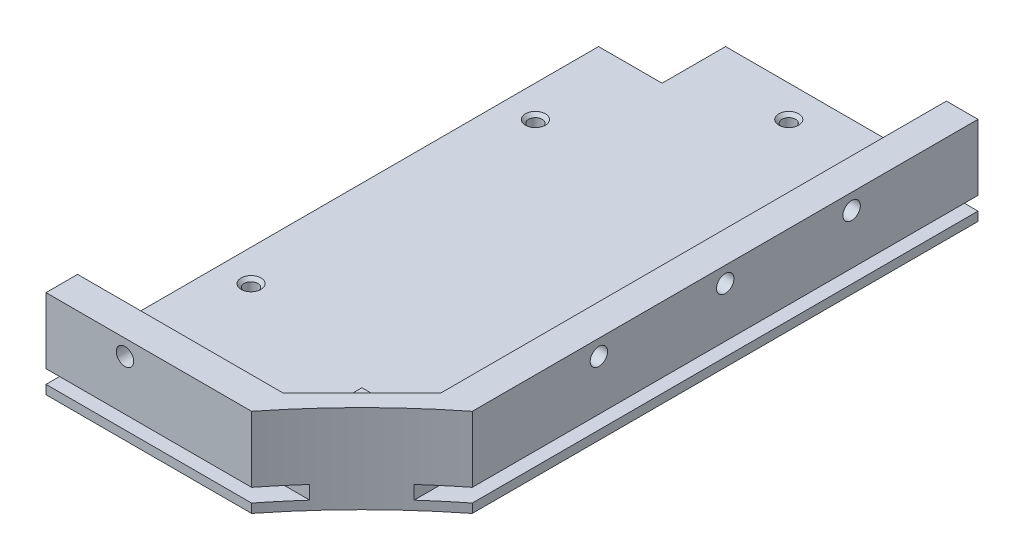
ISO-10303-21;
HEADER;
FILE_DESCRIPTION(('STEP AP214'),'2;1');
FILE_NAME('part.step','',(''),(''),'','','');
FILE_SCHEMA(('AUTOMOTIVE_DESIGN { 1 0 10303 214 1 1 1 1 }'));
ENDSEC;
DATA;
#1=APPLICATION_CONTEXT('core data for automotive mechanical design processes');
#2=APPLICATION_PROTOCOL_DEFINITION('international standard','automotive_design',2000,#1);
#3=PRODUCT_CONTEXT('',#1,'mechanical');
#4=PRODUCT('Part','Part','',(#3));
#5=PRODUCT_RELATED_PRODUCT_CATEGORY('part','',(#4));
#6=PRODUCT_DEFINITION_FORMATION('','',#4);
#7=PRODUCT_DEFINITION_CONTEXT('part definition',#1,'design');
#8=PRODUCT_DEFINITION('design','',#6,#7);
#9=PRODUCT_DEFINITION_SHAPE('','',#8);
#10=(LENGTH_UNIT() NAMED_UNIT(*) SI_UNIT(.MILLI.,.METRE.));
#11=(NAMED_UNIT(*) PLANE_ANGLE_UNIT() SI_UNIT($,.RADIAN.));
#12=(NAMED_UNIT(*) SI_UNIT($,.STERADIAN.) SOLID_ANGLE_UNIT());
#13=UNCERTAINTY_MEASURE_WITH_UNIT(LENGTH_MEASURE(1.E-05),#10,'distance_accuracy_value','');
#14=(GEOMETRIC_REPRESENTATION_CONTEXT(3) GLOBAL_UNCERTAINTY_ASSIGNED_CONTEXT((#13)) GLOBAL_UNIT_ASSIGNED_CONTEXT((#10,
#11,#12)) REPRESENTATION_CONTEXT('',''));
#15=CARTESIAN_POINT('',(0.,0.,0.));
#16=DIRECTION('',(0.,0.,1.));
#17=DIRECTION('',(1.,0.,0.));
#18=AXIS2_PLACEMENT_3D('',#15,#16,#17);
#19=CARTESIAN_POINT('',(160.08,28.,-429.92));
#20=DIRECTION('',(1.,0.,0.));
#21=DIRECTION('',(0.,0.,-1.));
#22=AXIS2_PLACEMENT_3D('',#19,#20,#21);
#23=PLANE('',#22);
#24=DIRECTION('',(0.,0.,1.));
#25=VECTOR('',#24,1.);
#26=CARTESIAN_POINT('',(160.08,17.,-489.92));
#27=LINE('',#26,#25);
#28=CARTESIAN_POINT('',(160.08,17.,-489.92));
#29=VERTEX_POINT('',#28);
#30=CARTESIAN_POINT('',(160.08,17.,-465.));
#31=VERTEX_POINT('',#30);
#32=EDGE_CURVE('E302',#29,#31,#27,.T.);
#33=ORIENTED_EDGE('',*,*,#32,.F.);
#34=DIRECTION('',(0.,-1.,0.));
#35=VECTOR('',#34,1.);
#36=CARTESIAN_POINT('',(160.08,28.,-489.92));
#37=LINE('',#36,#35);
#38=CARTESIAN_POINT('',(160.08,8.,-489.92));
#39=VERTEX_POINT('',#38);
#40=EDGE_CURVE('E312',#29,#39,#37,.T.);
#41=ORIENTED_EDGE('',*,*,#40,.T.);
#42=DIRECTION('',(0.,0.,-1.));
#43=VECTOR('',#42,1.);
#44=CARTESIAN_POINT('',(160.08,8.,-429.92));
#45=LINE('',#44,#43);
#46=CARTESIAN_POINT('',(160.08,8.,-475.));
#47=VERTEX_POINT('',#46);
#48=EDGE_CURVE('E319',#47,#39,#45,.T.);
#49=ORIENTED_EDGE('',*,*,#48,.F.);
#50=DIRECTION('',(0.,-0.668964731622449,-0.743294146247167));
#51=VECTOR('',#50,1.);
#52=CARTESIAN_POINT('',(160.08,17.,-465.));
#53=LINE('',#52,#51);
#54=EDGE_CURVE('E368',#31,#47,#53,.T.);
#55=ORIENTED_EDGE('',*,*,#54,.F.);
#56=EDGE_LOOP('',(#33,#41,#49,#55));
#57=FACE_BOUND('',#56,.T.);
#58=ADVANCED_FACE('F48',(#57),#23,.F.);
#59=CARTESIAN_POINT('',(0.,0.,-489.92));
#60=DIRECTION('',(0.,0.,1.));
#61=DIRECTION('',(1.,0.,0.));
#62=AXIS2_PLACEMENT_3D('',#59,#60,#61);
#63=PLANE('',#62);
#64=DIRECTION('',(-1.,0.,0.));
#65=VECTOR('',#64,1.);
#66=CARTESIAN_POINT('',(185.,17.,-489.92));
#67=LINE('',#66,#65);
#68=CARTESIAN_POINT('',(185.,17.,-489.92));
#69=VERTEX_POINT('',#68);
#70=EDGE_CURVE('E299',#69,#29,#67,.T.);
#71=ORIENTED_EDGE('',*,*,#70,.F.);
#72=DIRECTION('',(0.743294146247166,0.66896473162245,0.));
#73=VECTOR('',#72,1.);
#74=CARTESIAN_POINT('',(185.,17.,-489.92));
#75=LINE('',#74,#73);
#76=CARTESIAN_POINT('',(175.,8.,-489.92));
#77=VERTEX_POINT('',#76);
#78=EDGE_CURVE('E389',#77,#69,#75,.T.);
#79=ORIENTED_EDGE('',*,*,#78,.F.);
#80=DIRECTION('',(1.,0.,0.));
#81=VECTOR('',#80,1.);
#82=CARTESIAN_POINT('',(160.08,8.,-489.92));
#83=LINE('',#82,#81);
#84=EDGE_CURVE('E315',#39,#77,#83,.T.);
#85=ORIENTED_EDGE('',*,*,#84,.F.);
#86=ORIENTED_EDGE('',*,*,#40,.F.);
#87=EDGE_LOOP('',(#71,#79,#85,#86));
#88=FACE_BOUND('',#87,.T.);
#89=ADVANCED_FACE('F520',(#88),#63,.F.);
#90=CARTESIAN_POINT('',(0.,8.,0.));
#91=DIRECTION('',(0.,-1.,0.));
#92=DIRECTION('',(0.,0.,-1.));
#93=AXIS2_PLACEMENT_3D('',#90,#91,#92);
#94=PLANE('',#93);
#95=CARTESIAN_POINT('',(105.,8.,-509.9));
#96=DIRECTION('',(0.,-1.,0.));
#97=DIRECTION('',(0.,0.,-1.));
#98=AXIS2_PLACEMENT_3D('',#95,#96,#97);
#99=CIRCLE('',#98,3.14999999999999);
#100=CARTESIAN_POINT('',(105.,8.,-513.05));
#101=VERTEX_POINT('',#100);
#102=EDGE_CURVE('E496',#101,#101,#99,.T.);
#103=ORIENTED_EDGE('',*,*,#102,.T.);
#104=EDGE_LOOP('',(#103));
#105=FACE_BOUND('',#104,.T.);
#106=CARTESIAN_POINT('',(145.1,8.,-640.));
#107=DIRECTION('',(0.,-1.,0.));
#108=DIRECTION('',(0.,0.,-1.));
#109=AXIS2_PLACEMENT_3D('',#106,#107,#108);
#110=CIRCLE('',#109,3.14999999999999);
#111=CARTESIAN_POINT('',(145.1,8.,-643.15));
#112=VERTEX_POINT('',#111);
#113=EDGE_CURVE('E492',#112,#112,#110,.T.);
#114=ORIENTED_EDGE('',*,*,#113,.T.);
#115=EDGE_LOOP('',(#114));
#116=FACE_BOUND('',#115,.T.);
#117=CARTESIAN_POINT('',(105.,8.,-599.9));
#118=DIRECTION('',(0.,-1.,0.));
#119=DIRECTION('',(0.,0.,-1.));
#120=AXIS2_PLACEMENT_3D('',#117,#118,#119);
#121=CIRCLE('',#120,3.14999999999999);
#122=CARTESIAN_POINT('',(105.,8.,-603.05));
#123=VERTEX_POINT('',#122);
#124=EDGE_CURVE('E488',#123,#123,#121,.T.);
#125=ORIENTED_EDGE('',*,*,#124,.T.);
#126=EDGE_LOOP('',(#125));
#127=FACE_BOUND('',#126,.T.);
#128=DIRECTION('',(-1.,0.,0.));
#129=VECTOR('',#128,1.);
#130=CARTESIAN_POINT('',(0.,8.,-650.));
#131=LINE('',#130,#129);
#132=CARTESIAN_POINT('',(175.,8.,-650.));
#133=VERTEX_POINT('',#132);
#134=CARTESIAN_POINT('',(115.1,8.,-650.));
#135=VERTEX_POINT('',#134);
#136=EDGE_CURVE('E437',#133,#135,#131,.T.);
#137=ORIENTED_EDGE('',*,*,#136,.T.);
#138=DIRECTION('',(0.,0.,1.));
#139=VECTOR('',#138,1.);
#140=CARTESIAN_POINT('',(115.1,8.,0.));
#141=LINE('',#140,#139);
#142=CARTESIAN_POINT('',(115.1,8.,-629.9));
#143=VERTEX_POINT('',#142);
#144=EDGE_CURVE('E235',#135,#143,#141,.T.);
#145=ORIENTED_EDGE('',*,*,#144,.T.);
#146=DIRECTION('',(-1.,0.,0.));
#147=VECTOR('',#146,1.);
#148=CARTESIAN_POINT('',(0.,8.,-629.9));
#149=LINE('',#148,#147);
#150=CARTESIAN_POINT('',(95.,8.00000000000001,-629.9));
#151=VERTEX_POINT('',#150);
#152=EDGE_CURVE('E201',#143,#151,#149,.T.);
#153=ORIENTED_EDGE('',*,*,#152,.T.);
#154=DIRECTION('',(0.,0.,1.));
#155=VECTOR('',#154,1.);
#156=CARTESIAN_POINT('',(95.,8.,0.));
#157=LINE('',#156,#155);
#158=CARTESIAN_POINT('',(95.,8.00000000000002,-475.));
#159=VERTEX_POINT('',#158);
#160=EDGE_CURVE('E260',#151,#159,#157,.T.);
#161=ORIENTED_EDGE('',*,*,#160,.T.);
#162=DIRECTION('',(-1.,0.,0.));
#163=VECTOR('',#162,1.);
#164=CARTESIAN_POINT('',(160.08,8.,-475.));
#165=LINE('',#164,#163);
#166=EDGE_CURVE('E373',#47,#159,#165,.T.);
#167=ORIENTED_EDGE('',*,*,#166,.F.);
#168=ORIENTED_EDGE('',*,*,#48,.T.);
#169=ORIENTED_EDGE('',*,*,#84,.T.);
#170=DIRECTION('',(0.,0.,-1.));
#171=VECTOR('',#170,1.);
#172=CARTESIAN_POINT('',(175.,8.,-489.92));
#173=LINE('',#172,#171);
#174=EDGE_CURVE('E398',#77,#133,#173,.T.);
#175=ORIENTED_EDGE('',*,*,#174,.T.);
#176=EDGE_LOOP('',(#137,#145,#153,#161,#167,#168,#169,#175));
#177=FACE_BOUND('',#176,.T.);
#178=ADVANCED_FACE('F527',(#105,#116,#127,#177),#94,.F.);
#179=CARTESIAN_POINT('',(195.,0.,-489.924225024707));
#180=DIRECTION('',(1.,0.,0.));
#181=DIRECTION('',(0.,0.,-1.));
#182=AXIS2_PLACEMENT_3D('',#179,#180,#181);
#183=PLANE('',#182);
#184=CARTESIAN_POINT('',(195.,23.,-610.));
#185=DIRECTION('',(1.,0.,0.));
#186=DIRECTION('',(0.,0.,-1.));
#187=AXIS2_PLACEMENT_3D('',#184,#185,#186);
#188=CIRCLE('',#187,2.75000000000004);
#189=CARTESIAN_POINT('',(195.,23.,-612.75));
#190=VERTEX_POINT('',#189);
#191=EDGE_CURVE('E291',#190,#190,#188,.T.);
#192=ORIENTED_EDGE('',*,*,#191,.F.);
#193=EDGE_LOOP('',(#192));
#194=FACE_BOUND('',#193,.T.);
#195=CARTESIAN_POINT('',(195.,23.,-570.));
#196=DIRECTION('',(1.,0.,0.));
#197=DIRECTION('',(0.,0.,-1.));
#198=AXIS2_PLACEMENT_3D('',#195,#196,#197);
#199=CIRCLE('',#198,2.75000000000004);
#200=CARTESIAN_POINT('',(195.,23.,-572.75));
#201=VERTEX_POINT('',#200);
#202=EDGE_CURVE('E287',#201,#201,#199,.T.);
#203=ORIENTED_EDGE('',*,*,#202,.F.);
#204=EDGE_LOOP('',(#203));
#205=FACE_BOUND('',#204,.T.);
#206=CARTESIAN_POINT('',(195.,23.,-530.));
#207=DIRECTION('',(1.,0.,0.));
#208=DIRECTION('',(0.,0.,-1.));
#209=AXIS2_PLACEMENT_3D('',#206,#207,#208);
#210=CIRCLE('',#209,2.75000000000004);
#211=CARTESIAN_POINT('',(195.,23.,-532.75));
#212=VERTEX_POINT('',#211);
#213=EDGE_CURVE('E276',#212,#212,#210,.T.);
#214=ORIENTED_EDGE('',*,*,#213,.F.);
#215=EDGE_LOOP('',(#214));
#216=FACE_BOUND('',#215,.T.);
#217=DIRECTION('',(0.,0.,-1.));
#218=VECTOR('',#217,1.);
#219=CARTESIAN_POINT('',(195.,28.,-489.92));
#220=LINE('',#219,#218);
#221=CARTESIAN_POINT('',(195.,28.,-489.924225024706));
#222=VERTEX_POINT('',#221);
#223=CARTESIAN_POINT('',(195.,28.,-650.));
#224=VERTEX_POINT('',#223);
#225=EDGE_CURVE('E409',#222,#224,#220,.T.);
#226=ORIENTED_EDGE('',*,*,#225,.F.);
#227=DIRECTION('',(0.,1.,0.));
#228=VECTOR('',#227,1.);
#229=CARTESIAN_POINT('',(195.,0.,-489.924225024707));
#230=LINE('',#229,#228);
#231=CARTESIAN_POINT('',(195.,7.15,-489.924225024707));
#232=VERTEX_POINT('',#231);
#233=EDGE_CURVE('E449',#222,#232,#230,.F.);
#234=ORIENTED_EDGE('',*,*,#233,.T.);
#235=DIRECTION('',(0.,0.,1.));
#236=VECTOR('',#235,1.);
#237=CARTESIAN_POINT('',(195.,7.15,-489.924225024707));
#238=LINE('',#237,#236);
#239=CARTESIAN_POINT('',(195.,7.15,-650.));
#240=VERTEX_POINT('',#239);
#241=EDGE_CURVE('E467',#240,#232,#238,.T.);
#242=ORIENTED_EDGE('',*,*,#241,.F.);
#243=DIRECTION('',(0.,1.,0.));
#244=VECTOR('',#243,1.);
#245=CARTESIAN_POINT('',(195.,0.,-650.));
#246=LINE('',#245,#244);
#247=EDGE_CURVE('E427',#240,#224,#246,.T.);
#248=ORIENTED_EDGE('',*,*,#247,.T.);
#249=EDGE_LOOP('',(#226,#234,#242,#248));
#250=FACE_BOUND('',#249,.T.);
#251=ADVANCED_FACE('F583',(#194,#205,#216,#250),#183,.T.);
#252=CARTESIAN_POINT('',(195.,0.,-455.));
#253=DIRECTION('',(0.,0.,1.));
#254=DIRECTION('',(1.,0.,0.));
#255=AXIS2_PLACEMENT_3D('',#252,#253,#254);
#256=PLANE('',#255);
#257=DIRECTION('',(0.,1.,0.));
#258=VECTOR('',#257,1.);
#259=CARTESIAN_POINT('',(95.,0.,-455.));
#260=LINE('',#259,#258);
#261=CARTESIAN_POINT('',(95.,0.,-455.));
#262=VERTEX_POINT('',#261);
#263=CARTESIAN_POINT('',(95.,2.85,-455.));
#264=VERTEX_POINT('',#263);
#265=EDGE_CURVE('E244',#262,#264,#260,.T.);
#266=ORIENTED_EDGE('',*,*,#265,.F.);
#267=DIRECTION('',(1.,0.,0.));
#268=VECTOR('',#267,1.);
#269=CARTESIAN_POINT('',(160.075774975293,0.,-455.));
#270=LINE('',#269,#268);
#271=CARTESIAN_POINT('',(160.075774975293,0.,-455.));
#272=VERTEX_POINT('',#271);
#273=EDGE_CURVE('E412',#262,#272,#270,.T.);
#274=ORIENTED_EDGE('',*,*,#273,.T.);
#275=DIRECTION('',(0.,1.,0.));
#276=VECTOR('',#275,1.);
#277=CARTESIAN_POINT('',(160.075774975293,0.,-455.));
#278=LINE('',#277,#276);
#279=CARTESIAN_POINT('',(160.075774975293,2.85,-455.));
#280=VERTEX_POINT('',#279);
#281=EDGE_CURVE('E444',#272,#280,#278,.T.);
#282=ORIENTED_EDGE('',*,*,#281,.T.);
#283=DIRECTION('',(1.,0.,0.));
#284=VECTOR('',#283,1.);
#285=CARTESIAN_POINT('',(195.,2.85,-455.));
#286=LINE('',#285,#284);
#287=EDGE_CURVE('E457',#264,#280,#286,.T.);
#288=ORIENTED_EDGE('',*,*,#287,.F.);
#289=EDGE_LOOP('',(#266,#274,#282,#288));
#290=FACE_BOUND('',#289,.T.);
#291=ADVANCED_FACE('F588',(#290),#256,.T.);
#292=CARTESIAN_POINT('',(0.,8.,-650.));
#293=DIRECTION('',(0.,0.,1.));
#294=DIRECTION('',(1.,0.,0.));
#295=AXIS2_PLACEMENT_3D('',#292,#293,#294);
#296=PLANE('',#295);
#297=DIRECTION('',(-1.,0.,0.));
#298=VECTOR('',#297,1.);
#299=CARTESIAN_POINT('',(0.,0.,-650.));
#300=LINE('',#299,#298);
#301=CARTESIAN_POINT('',(195.,0.,-650.));
#302=VERTEX_POINT('',#301);
#303=CARTESIAN_POINT('',(115.1,0.,-650.));
#304=VERTEX_POINT('',#303);
#305=EDGE_CURVE('E436',#302,#304,#300,.T.);
#306=ORIENTED_EDGE('',*,*,#305,.T.);
#307=DIRECTION('',(0.,1.,0.));
#308=VECTOR('',#307,1.);
#309=CARTESIAN_POINT('',(115.1,0.,-650.));
#310=LINE('',#309,#308);
#311=EDGE_CURVE('E205',#304,#135,#310,.T.);
#312=ORIENTED_EDGE('',*,*,#311,.T.);
#313=ORIENTED_EDGE('',*,*,#136,.F.);
#314=DIRECTION('',(0.743294146247166,0.66896473162245,0.));
#315=VECTOR('',#314,1.);
#316=CARTESIAN_POINT('',(185.,17.,-650.));
#317=LINE('',#316,#315);
#318=CARTESIAN_POINT('',(185.,17.,-650.));
#319=VERTEX_POINT('',#318);
#320=EDGE_CURVE('E377',#133,#319,#317,.T.);
#321=ORIENTED_EDGE('',*,*,#320,.T.);
#322=DIRECTION('',(0.,1.,0.));
#323=VECTOR('',#322,1.);
#324=CARTESIAN_POINT('',(185.,28.,-650.));
#325=LINE('',#324,#323);
#326=CARTESIAN_POINT('',(185.,28.,-650.));
#327=VERTEX_POINT('',#326);
#328=EDGE_CURVE('E402',#319,#327,#325,.T.);
#329=ORIENTED_EDGE('',*,*,#328,.T.);
#330=DIRECTION('',(1.,0.,0.));
#331=VECTOR('',#330,1.);
#332=CARTESIAN_POINT('',(195.,28.,-650.));
#333=LINE('',#332,#331);
#334=EDGE_CURVE('E394',#327,#224,#333,.T.);
#335=ORIENTED_EDGE('',*,*,#334,.T.);
#336=ORIENTED_EDGE('',*,*,#247,.F.);
#337=DIRECTION('',(1.,0.,0.));
#338=VECTOR('',#337,1.);
#339=CARTESIAN_POINT('',(195.,7.15,-650.));
#340=LINE('',#339,#338);
#341=CARTESIAN_POINT('',(185.,7.15,-650.));
#342=VERTEX_POINT('',#341);
#343=EDGE_CURVE('E331',#342,#240,#340,.T.);
#344=ORIENTED_EDGE('',*,*,#343,.F.);
#345=DIRECTION('',(0.,1.,0.));
#346=VECTOR('',#345,1.);
#347=CARTESIAN_POINT('',(185.,7.15,-650.));
#348=LINE('',#347,#346);
#349=CARTESIAN_POINT('',(185.,2.85,-650.));
#350=VERTEX_POINT('',#349);
#351=EDGE_CURVE('E327',#350,#342,#348,.T.);
#352=ORIENTED_EDGE('',*,*,#351,.F.);
#353=DIRECTION('',(-1.,0.,0.));
#354=VECTOR('',#353,1.);
#355=CARTESIAN_POINT('',(185.,2.85,-650.));
#356=LINE('',#355,#354);
#357=CARTESIAN_POINT('',(195.,2.85,-650.));
#358=VERTEX_POINT('',#357);
#359=EDGE_CURVE('E323',#358,#350,#356,.T.);
#360=ORIENTED_EDGE('',*,*,#359,.F.);
#361=EDGE_CURVE('E428',#302,#358,#246,.T.);
#362=ORIENTED_EDGE('',*,*,#361,.F.);
#363=EDGE_LOOP('',(#306,#312,#313,#321,#329,#335,#336,#344,#352,#360,#362));
#364=FACE_BOUND('',#363,.T.);
#365=ADVANCED_FACE('F596',(#364),#296,.F.);
#366=CARTESIAN_POINT('',(0.,0.,0.));
#367=DIRECTION('',(0.,-1.,0.));
#368=DIRECTION('',(0.,0.,-1.));
#369=AXIS2_PLACEMENT_3D('',#366,#367,#368);
#370=PLANE('',#369);
#371=CARTESIAN_POINT('',(145.1,0.,-640.));
#372=DIRECTION('',(0.,-1.,0.));
#373=DIRECTION('',(0.,0.,-1.));
#374=AXIS2_PLACEMENT_3D('',#371,#372,#373);
#375=CIRCLE('',#374,2.15000000000002);
#376=CARTESIAN_POINT('',(145.1,0.,-642.15));
#377=VERTEX_POINT('',#376);
#378=EDGE_CURVE('E222',#377,#377,#375,.T.);
#379=ORIENTED_EDGE('',*,*,#378,.F.);
#380=EDGE_LOOP('',(#379));
#381=FACE_BOUND('',#380,.T.);
#382=CARTESIAN_POINT('',(105.,0.,-509.9));
#383=DIRECTION('',(0.,-1.,0.));
#384=DIRECTION('',(0.,0.,-1.));
#385=AXIS2_PLACEMENT_3D('',#382,#383,#384);
#386=CIRCLE('',#385,2.15);
#387=CARTESIAN_POINT('',(105.,0.,-512.05));
#388=VERTEX_POINT('',#387);
#389=EDGE_CURVE('E226',#388,#388,#386,.T.);
#390=ORIENTED_EDGE('',*,*,#389,.F.);
#391=EDGE_LOOP('',(#390));
#392=FACE_BOUND('',#391,.T.);
#393=CARTESIAN_POINT('',(105.,0.,-599.9));
#394=DIRECTION('',(0.,-1.,0.));
#395=DIRECTION('',(0.,0.,-1.));
#396=AXIS2_PLACEMENT_3D('',#393,#394,#395);
#397=CIRCLE('',#396,2.15);
#398=CARTESIAN_POINT('',(105.,0.,-602.05));
#399=VERTEX_POINT('',#398);
#400=EDGE_CURVE('E478',#399,#399,#397,.T.);
#401=ORIENTED_EDGE('',*,*,#400,.F.);
#402=EDGE_LOOP('',(#401));
#403=FACE_BOUND('',#402,.T.);
#404=DIRECTION('',(0.,0.,-1.));
#405=VECTOR('',#404,1.);
#406=CARTESIAN_POINT('',(115.1,0.,-650.));
#407=LINE('',#406,#405);
#408=CARTESIAN_POINT('',(115.1,0.,-629.9));
#409=VERTEX_POINT('',#408);
#410=EDGE_CURVE('E209',#409,#304,#407,.T.);
#411=ORIENTED_EDGE('',*,*,#410,.T.);
#412=ORIENTED_EDGE('',*,*,#305,.F.);
#413=DIRECTION('',(0.,0.,-1.));
#414=VECTOR('',#413,1.);
#415=CARTESIAN_POINT('',(195.,0.,-455.));
#416=LINE('',#415,#414);
#417=CARTESIAN_POINT('',(195.,0.,-489.924225024707));
#418=VERTEX_POINT('',#417);
#419=EDGE_CURVE('E424',#418,#302,#416,.T.);
#420=ORIENTED_EDGE('',*,*,#419,.F.);
#421=CARTESIAN_POINT('',(325.,0.,-325.));
#422=DIRECTION('',(0.,1.,0.));
#423=DIRECTION('',(0.,0.,1.));
#424=AXIS2_PLACEMENT_3D('',#421,#422,#423);
#425=CIRCLE('',#424,210.);
#426=EDGE_CURVE('E432',#418,#272,#425,.T.);
#427=ORIENTED_EDGE('',*,*,#426,.T.);
#428=ORIENTED_EDGE('',*,*,#273,.F.);
#429=DIRECTION('',(0.,0.,-1.));
#430=VECTOR('',#429,1.);
#431=CARTESIAN_POINT('',(95.,0.,-650.));
#432=LINE('',#431,#430);
#433=CARTESIAN_POINT('',(95.,0.,-629.9));
#434=VERTEX_POINT('',#433);
#435=EDGE_CURVE('E220',#262,#434,#432,.T.);
#436=ORIENTED_EDGE('',*,*,#435,.T.);
#437=DIRECTION('',(1.,0.,0.));
#438=VECTOR('',#437,1.);
#439=CARTESIAN_POINT('',(115.1,0.,-629.9));
#440=LINE('',#439,#438);
#441=EDGE_CURVE('E65',#434,#409,#440,.T.);
#442=ORIENTED_EDGE('',*,*,#441,.T.);
#443=EDGE_LOOP('',(#411,#412,#420,#427,#428,#436,#442));
#444=FACE_BOUND('',#443,.T.);
#445=ADVANCED_FACE('F218',(#381,#392,#403,#444),#370,.T.);
#446=CARTESIAN_POINT('',(325.,0.,-325.));
#447=DIRECTION('',(0.,1.,0.));
#448=DIRECTION('',(0.,0.,1.));
#449=AXIS2_PLACEMENT_3D('',#446,#447,#448);
#450=CYLINDRICAL_SURFACE('',#449,210.);
#451=ORIENTED_EDGE('',*,*,#233,.F.);
#452=CARTESIAN_POINT('',(325.,28.,-325.));
#453=DIRECTION('',(0.,1.,0.));
#454=DIRECTION('',(0.,0.,1.));
#455=AXIS2_PLACEMENT_3D('',#452,#453,#454);
#456=CIRCLE('',#455,210.);
#457=CARTESIAN_POINT('',(160.075774975294,28.,-455.));
#458=VERTEX_POINT('',#457);
#459=EDGE_CURVE('E306',#222,#458,#456,.T.);
#460=ORIENTED_EDGE('',*,*,#459,.T.);
#461=CARTESIAN_POINT('',(160.075774975293,7.15,-455.));
#462=VERTEX_POINT('',#461);
#463=EDGE_CURVE('E441',#462,#458,#278,.T.);
#464=ORIENTED_EDGE('',*,*,#463,.F.);
#465=CARTESIAN_POINT('',(325.,7.15000000000001,-325.));
#466=DIRECTION('',(0.,1.,0.));
#467=DIRECTION('',(0.,0.,1.));
#468=AXIS2_PLACEMENT_3D('',#465,#466,#467);
#469=CIRCLE('',#468,210.);
#470=CARTESIAN_POINT('',(168.475241575015,7.15,-465.));
#471=VERTEX_POINT('',#470);
#472=EDGE_CURVE('E353',#462,#471,#469,.F.);
#473=ORIENTED_EDGE('',*,*,#472,.T.);
#474=DIRECTION('',(0.,1.,0.));
#475=VECTOR('',#474,1.);
#476=CARTESIAN_POINT('',(168.475241575015,0.,-465.));
#477=LINE('',#476,#475);
#478=CARTESIAN_POINT('',(168.475241575015,2.85,-465.));
#479=VERTEX_POINT('',#478);
#480=EDGE_CURVE('E460',#471,#479,#477,.F.);
#481=ORIENTED_EDGE('',*,*,#480,.T.);
#482=CARTESIAN_POINT('',(325.,2.85,-325.));
#483=DIRECTION('',(0.,-1.,0.));
#484=DIRECTION('',(0.,0.,-1.));
#485=AXIS2_PLACEMENT_3D('',#482,#483,#484);
#486=CIRCLE('',#485,210.);
#487=EDGE_CURVE('E360',#479,#280,#486,.F.);
#488=ORIENTED_EDGE('',*,*,#487,.T.);
#489=ORIENTED_EDGE('',*,*,#281,.F.);
#490=ORIENTED_EDGE('',*,*,#426,.F.);
#491=CARTESIAN_POINT('',(195.,2.85,-489.924225024707));
#492=VERTEX_POINT('',#491);
#493=EDGE_CURVE('E448',#492,#418,#230,.F.);
#494=ORIENTED_EDGE('',*,*,#493,.F.);
#495=CARTESIAN_POINT('',(325.,2.84999999999998,-325.));
#496=DIRECTION('',(0.,-1.,0.));
#497=DIRECTION('',(1.,0.,0.));
#498=AXIS2_PLACEMENT_3D('',#495,#496,#497);
#499=CIRCLE('',#498,210.);
#500=CARTESIAN_POINT('',(185.,2.85,-481.524758424985));
#501=VERTEX_POINT('',#500);
#502=EDGE_CURVE('E338',#492,#501,#499,.F.);
#503=ORIENTED_EDGE('',*,*,#502,.T.);
#504=DIRECTION('',(0.,1.,0.));
#505=VECTOR('',#504,1.);
#506=CARTESIAN_POINT('',(185.,0.,-481.524758424985));
#507=LINE('',#506,#505);
#508=CARTESIAN_POINT('',(185.,7.15,-481.524758424985));
#509=VERTEX_POINT('',#508);
#510=EDGE_CURVE('E470',#501,#509,#507,.T.);
#511=ORIENTED_EDGE('',*,*,#510,.T.);
#512=CARTESIAN_POINT('',(325.,7.15,-325.));
#513=DIRECTION('',(0.,1.,0.));
#514=DIRECTION('',(0.,0.,1.));
#515=AXIS2_PLACEMENT_3D('',#512,#513,#514);
#516=CIRCLE('',#515,210.);
#517=EDGE_CURVE('E344',#509,#232,#516,.F.);
#518=ORIENTED_EDGE('',*,*,#517,.T.);
#519=EDGE_LOOP('',(#451,#460,#464,#473,#481,#488,#489,#490,#494,#503,#511,#518));
#520=FACE_BOUND('',#519,.T.);
#521=ADVANCED_FACE('F586',(#520),#450,.F.);
#522=CARTESIAN_POINT('',(95.,7.15,-455.));
#523=VERTEX_POINT('',#522);
#524=CARTESIAN_POINT('',(95.,28.,-455.));
#525=VERTEX_POINT('',#524);
#526=EDGE_CURVE('E243',#523,#525,#260,.T.);
#527=ORIENTED_EDGE('',*,*,#526,.F.);
#528=DIRECTION('',(-1.,0.,0.));
#529=VECTOR('',#528,1.);
#530=CARTESIAN_POINT('',(195.,7.15,-455.));
#531=LINE('',#530,#529);
#532=EDGE_CURVE('E453',#462,#523,#531,.T.);
#533=ORIENTED_EDGE('',*,*,#532,.F.);
#534=ORIENTED_EDGE('',*,*,#463,.T.);
#535=DIRECTION('',(-1.,0.,0.));
#536=VECTOR('',#535,1.);
#537=CARTESIAN_POINT('',(160.08,28.,-455.));
#538=LINE('',#537,#536);
#539=EDGE_CURVE('E372',#458,#525,#538,.T.);
#540=ORIENTED_EDGE('',*,*,#539,.T.);
#541=EDGE_LOOP('',(#527,#533,#534,#540));
#542=FACE_BOUND('',#541,.T.);
#543=CARTESIAN_POINT('',(120.,23.,-455.));
#544=DIRECTION('',(0.,0.,1.));
#545=DIRECTION('',(1.,0.,0.));
#546=AXIS2_PLACEMENT_3D('',#543,#544,#545);
#547=CIRCLE('',#546,2.75000000000001);
#548=CARTESIAN_POINT('',(122.75,23.,-455.));
#549=VERTEX_POINT('',#548);
#550=EDGE_CURVE('E267',#549,#549,#547,.T.);
#551=ORIENTED_EDGE('',*,*,#550,.F.);
#552=EDGE_LOOP('',(#551));
#553=FACE_BOUND('',#552,.T.);
#554=ADVANCED_FACE('F581',(#542,#553),#256,.T.);
#555=DIRECTION('',(0.,0.,-1.));
#556=VECTOR('',#555,1.);
#557=CARTESIAN_POINT('',(195.,2.85,-489.924225024707));
#558=LINE('',#557,#556);
#559=EDGE_CURVE('E464',#492,#358,#558,.T.);
#560=ORIENTED_EDGE('',*,*,#559,.F.);
#561=ORIENTED_EDGE('',*,*,#493,.T.);
#562=ORIENTED_EDGE('',*,*,#419,.T.);
#563=ORIENTED_EDGE('',*,*,#361,.T.);
#564=EDGE_LOOP('',(#560,#561,#562,#563));
#565=FACE_BOUND('',#564,.T.);
#566=ADVANCED_FACE('F571',(#565),#183,.T.);
#567=CARTESIAN_POINT('',(195.,28.,-489.92));
#568=DIRECTION('',(0.,1.,0.));
#569=DIRECTION('',(0.,0.,1.));
#570=AXIS2_PLACEMENT_3D('',#567,#568,#569);
#571=PLANE('',#570);
#572=DIRECTION('',(0.,0.,-1.));
#573=VECTOR('',#572,1.);
#574=CARTESIAN_POINT('',(95.,28.,-650.));
#575=LINE('',#574,#573);
#576=CARTESIAN_POINT('',(95.,28.,-465.));
#577=VERTEX_POINT('',#576);
#578=EDGE_CURVE('E238',#525,#577,#575,.T.);
#579=ORIENTED_EDGE('',*,*,#578,.F.);
#580=ORIENTED_EDGE('',*,*,#539,.F.);
#581=ORIENTED_EDGE('',*,*,#459,.F.);
#582=ORIENTED_EDGE('',*,*,#225,.T.);
#583=ORIENTED_EDGE('',*,*,#334,.F.);
#584=DIRECTION('',(0.,0.,-1.));
#585=VECTOR('',#584,1.);
#586=CARTESIAN_POINT('',(185.,28.,-489.92));
#587=LINE('',#586,#585);
#588=CARTESIAN_POINT('',(185.,28.,-489.92));
#589=VERTEX_POINT('',#588);
#590=EDGE_CURVE('E413',#589,#327,#587,.T.);
#591=ORIENTED_EDGE('',*,*,#590,.F.);
#592=DIRECTION('',(0.707106781186547,0.,-0.707106781186548));
#593=VECTOR('',#592,1.);
#594=CARTESIAN_POINT('',(160.08,28.,-465.));
#595=LINE('',#594,#593);
#596=CARTESIAN_POINT('',(160.08,28.,-465.));
#597=VERTEX_POINT('',#596);
#598=EDGE_CURVE('E295',#597,#589,#595,.T.);
#599=ORIENTED_EDGE('',*,*,#598,.F.);
#600=DIRECTION('',(-1.,0.,0.));
#601=VECTOR('',#600,1.);
#602=CARTESIAN_POINT('',(160.08,28.,-465.));
#603=LINE('',#602,#601);
#604=EDGE_CURVE('E382',#597,#577,#603,.T.);
#605=ORIENTED_EDGE('',*,*,#604,.T.);
#606=EDGE_LOOP('',(#579,#580,#581,#582,#583,#591,#599,#605));
#607=FACE_BOUND('',#606,.T.);
#608=ADVANCED_FACE('F567',(#607),#571,.T.);
#609=CARTESIAN_POINT('',(185.,28.,-489.92));
#610=DIRECTION('',(-1.,0.,0.));
#611=DIRECTION('',(0.,0.,1.));
#612=AXIS2_PLACEMENT_3D('',#609,#610,#611);
#613=PLANE('',#612);
#614=CARTESIAN_POINT('',(185.,23.,-610.));
#615=DIRECTION('',(-1.,0.,0.));
#616=DIRECTION('',(0.,0.,1.));
#617=AXIS2_PLACEMENT_3D('',#614,#615,#616);
#618=CIRCLE('',#617,2.75000000000004);
#619=CARTESIAN_POINT('',(185.,23.,-607.25));
#620=VERTEX_POINT('',#619);
#621=EDGE_CURVE('E272',#620,#620,#618,.T.);
#622=ORIENTED_EDGE('',*,*,#621,.F.);
#623=EDGE_LOOP('',(#622));
#624=FACE_BOUND('',#623,.T.);
#625=CARTESIAN_POINT('',(185.,23.,-570.));
#626=DIRECTION('',(-1.,0.,0.));
#627=DIRECTION('',(0.,0.,1.));
#628=AXIS2_PLACEMENT_3D('',#625,#626,#627);
#629=CIRCLE('',#628,2.75000000000004);
#630=CARTESIAN_POINT('',(185.,23.,-567.25));
#631=VERTEX_POINT('',#630);
#632=EDGE_CURVE('E277',#631,#631,#629,.T.);
#633=ORIENTED_EDGE('',*,*,#632,.F.);
#634=EDGE_LOOP('',(#633));
#635=FACE_BOUND('',#634,.T.);
#636=CARTESIAN_POINT('',(185.,23.,-530.));
#637=DIRECTION('',(-1.,0.,0.));
#638=DIRECTION('',(0.,0.,1.));
#639=AXIS2_PLACEMENT_3D('',#636,#637,#638);
#640=CIRCLE('',#639,2.75000000000004);
#641=CARTESIAN_POINT('',(185.,23.,-527.25));
#642=VERTEX_POINT('',#641);
#643=EDGE_CURVE('E271',#642,#642,#640,.T.);
#644=ORIENTED_EDGE('',*,*,#643,.F.);
#645=EDGE_LOOP('',(#644));
#646=FACE_BOUND('',#645,.T.);
#647=ORIENTED_EDGE('',*,*,#328,.F.);
#648=DIRECTION('',(0.,0.,-1.));
#649=VECTOR('',#648,1.);
#650=CARTESIAN_POINT('',(185.,17.,-489.92));
#651=LINE('',#650,#649);
#652=EDGE_CURVE('E416',#69,#319,#651,.T.);
#653=ORIENTED_EDGE('',*,*,#652,.F.);
#654=DIRECTION('',(0.,1.,0.));
#655=VECTOR('',#654,1.);
#656=CARTESIAN_POINT('',(185.,28.,-489.92));
#657=LINE('',#656,#655);
#658=EDGE_CURVE('E393',#69,#589,#657,.T.);
#659=ORIENTED_EDGE('',*,*,#658,.T.);
#660=ORIENTED_EDGE('',*,*,#590,.T.);
#661=EDGE_LOOP('',(#647,#653,#659,#660));
#662=FACE_BOUND('',#661,.T.);
#663=ADVANCED_FACE('F570',(#624,#635,#646,#662),#613,.T.);
#664=CARTESIAN_POINT('',(185.,17.,-489.92));
#665=DIRECTION('',(-0.66896473162245,0.743294146247166,0.));
#666=DIRECTION('',(-0.743294146247166,-0.668964731622451,0.));
#667=AXIS2_PLACEMENT_3D('',#664,#665,#666);
#668=PLANE('',#667);
#669=ORIENTED_EDGE('',*,*,#320,.F.);
#670=ORIENTED_EDGE('',*,*,#174,.F.);
#671=ORIENTED_EDGE('',*,*,#78,.T.);
#672=ORIENTED_EDGE('',*,*,#652,.T.);
#673=EDGE_LOOP('',(#669,#670,#671,#672));
#674=FACE_BOUND('',#673,.T.);
#675=ADVANCED_FACE('F562',(#674),#668,.T.);
#676=CARTESIAN_POINT('',(160.08,17.,-465.));
#677=DIRECTION('',(0.,0.743294146247167,-0.66896473162245));
#678=DIRECTION('',(0.,0.668964731622449,0.743294146247167));
#679=AXIS2_PLACEMENT_3D('',#676,#677,#678);
#680=PLANE('',#679);
#681=DIRECTION('',(0.,-0.668964731622449,-0.743294146247167));
#682=VECTOR('',#681,1.);
#683=CARTESIAN_POINT('',(95.,17.,-465.));
#684=LINE('',#683,#682);
#685=CARTESIAN_POINT('',(95.,17.,-465.));
#686=VERTEX_POINT('',#685);
#687=EDGE_CURVE('E256',#686,#159,#684,.T.);
#688=ORIENTED_EDGE('',*,*,#687,.F.);
#689=DIRECTION('',(-1.,0.,0.));
#690=VECTOR('',#689,1.);
#691=CARTESIAN_POINT('',(160.08,17.,-465.));
#692=LINE('',#691,#690);
#693=EDGE_CURVE('E378',#31,#686,#692,.T.);
#694=ORIENTED_EDGE('',*,*,#693,.F.);
#695=ORIENTED_EDGE('',*,*,#54,.T.);
#696=ORIENTED_EDGE('',*,*,#166,.T.);
#697=EDGE_LOOP('',(#688,#694,#695,#696));
#698=FACE_BOUND('',#697,.T.);
#699=ADVANCED_FACE('F559',(#698),#680,.T.);
#700=CARTESIAN_POINT('',(160.08,28.,-465.));
#701=DIRECTION('',(0.,0.,-1.));
#702=DIRECTION('',(-1.,0.,0.));
#703=AXIS2_PLACEMENT_3D('',#700,#701,#702);
#704=PLANE('',#703);
#705=DIRECTION('',(0.,-1.,0.));
#706=VECTOR('',#705,1.);
#707=CARTESIAN_POINT('',(95.,28.,-465.));
#708=LINE('',#707,#706);
#709=EDGE_CURVE('E253',#577,#686,#708,.T.);
#710=ORIENTED_EDGE('',*,*,#709,.F.);
#711=ORIENTED_EDGE('',*,*,#604,.F.);
#712=DIRECTION('',(0.,-1.,0.));
#713=VECTOR('',#712,1.);
#714=CARTESIAN_POINT('',(160.08,28.,-465.));
#715=LINE('',#714,#713);
#716=EDGE_CURVE('E364',#597,#31,#715,.T.);
#717=ORIENTED_EDGE('',*,*,#716,.T.);
#718=ORIENTED_EDGE('',*,*,#693,.T.);
#719=EDGE_LOOP('',(#710,#711,#717,#718));
#720=FACE_BOUND('',#719,.T.);
#721=CARTESIAN_POINT('',(120.,23.,-465.));
#722=DIRECTION('',(0.,0.,-1.));
#723=DIRECTION('',(-1.,0.,0.));
#724=AXIS2_PLACEMENT_3D('',#721,#722,#723);
#725=CIRCLE('',#724,2.75000000000001);
#726=CARTESIAN_POINT('',(117.25,23.,-465.));
#727=VERTEX_POINT('',#726);
#728=EDGE_CURVE('E263',#727,#727,#725,.T.);
#729=ORIENTED_EDGE('',*,*,#728,.F.);
#730=EDGE_LOOP('',(#729));
#731=FACE_BOUND('',#730,.T.);
#732=ADVANCED_FACE('F554',(#720,#731),#704,.T.);
#733=CARTESIAN_POINT('',(195.,7.15,-465.));
#734=DIRECTION('',(0.,0.,-1.));
#735=DIRECTION('',(-1.,0.,0.));
#736=AXIS2_PLACEMENT_3D('',#733,#734,#735);
#737=PLANE('',#736);
#738=DIRECTION('',(-1.,0.,0.));
#739=VECTOR('',#738,1.);
#740=CARTESIAN_POINT('',(195.,7.15,-465.));
#741=LINE('',#740,#739);
#742=CARTESIAN_POINT('',(95.,7.15,-465.));
#743=VERTEX_POINT('',#742);
#744=EDGE_CURVE('E348',#471,#743,#741,.T.);
#745=ORIENTED_EDGE('',*,*,#744,.T.);
#746=DIRECTION('',(0.,-1.,0.));
#747=VECTOR('',#746,1.);
#748=CARTESIAN_POINT('',(95.,7.15,-465.));
#749=LINE('',#748,#747);
#750=CARTESIAN_POINT('',(95.,2.85,-465.));
#751=VERTEX_POINT('',#750);
#752=EDGE_CURVE('E73',#743,#751,#749,.T.);
#753=ORIENTED_EDGE('',*,*,#752,.T.);
#754=DIRECTION('',(-1.,0.,0.));
#755=VECTOR('',#754,1.);
#756=CARTESIAN_POINT('',(195.,2.85,-465.));
#757=LINE('',#756,#755);
#758=EDGE_CURVE('E349',#479,#751,#757,.T.);
#759=ORIENTED_EDGE('',*,*,#758,.F.);
#760=ORIENTED_EDGE('',*,*,#480,.F.);
#761=EDGE_LOOP('',(#745,#753,#759,#760));
#762=FACE_BOUND('',#761,.T.);
#763=ADVANCED_FACE('F550',(#762),#737,.F.);
#764=CARTESIAN_POINT('',(195.,2.85,-465.));
#765=DIRECTION('',(0.,-1.,0.));
#766=DIRECTION('',(0.,0.,-1.));
#767=AXIS2_PLACEMENT_3D('',#764,#765,#766);
#768=PLANE('',#767);
#769=ORIENTED_EDGE('',*,*,#758,.T.);
#770=DIRECTION('',(0.,0.,1.));
#771=VECTOR('',#770,1.);
#772=CARTESIAN_POINT('',(95.,2.85,-465.));
#773=LINE('',#772,#771);
#774=EDGE_CURVE('E249',#751,#264,#773,.T.);
#775=ORIENTED_EDGE('',*,*,#774,.T.);
#776=ORIENTED_EDGE('',*,*,#287,.T.);
#777=ORIENTED_EDGE('',*,*,#487,.F.);
#778=EDGE_LOOP('',(#769,#775,#776,#777));
#779=FACE_BOUND('',#778,.T.);
#780=ADVANCED_FACE('F547',(#779),#768,.F.);
#781=CARTESIAN_POINT('',(195.,7.15,-455.));
#782=DIRECTION('',(0.,1.,0.));
#783=DIRECTION('',(0.,0.,1.));
#784=AXIS2_PLACEMENT_3D('',#781,#782,#783);
#785=PLANE('',#784);
#786=ORIENTED_EDGE('',*,*,#532,.T.);
#787=DIRECTION('',(0.,0.,-1.));
#788=VECTOR('',#787,1.);
#789=CARTESIAN_POINT('',(95.,7.15,-455.));
#790=LINE('',#789,#788);
#791=EDGE_CURVE('E474',#523,#743,#790,.T.);
#792=ORIENTED_EDGE('',*,*,#791,.T.);
#793=ORIENTED_EDGE('',*,*,#744,.F.);
#794=ORIENTED_EDGE('',*,*,#472,.F.);
#795=EDGE_LOOP('',(#786,#792,#793,#794));
#796=FACE_BOUND('',#795,.T.);
#797=ADVANCED_FACE('F541',(#796),#785,.F.);
#798=CARTESIAN_POINT('',(185.,7.15,-455.));
#799=DIRECTION('',(-1.,0.,0.));
#800=DIRECTION('',(0.,0.,1.));
#801=AXIS2_PLACEMENT_3D('',#798,#799,#800);
#802=PLANE('',#801);
#803=DIRECTION('',(0.,0.,-1.));
#804=VECTOR('',#803,1.);
#805=CARTESIAN_POINT('',(185.,2.85,-455.));
#806=LINE('',#805,#804);
#807=EDGE_CURVE('E334',#501,#350,#806,.T.);
#808=ORIENTED_EDGE('',*,*,#807,.T.);
#809=ORIENTED_EDGE('',*,*,#351,.T.);
#810=DIRECTION('',(0.,0.,-1.));
#811=VECTOR('',#810,1.);
#812=CARTESIAN_POINT('',(185.,7.15,-455.));
#813=LINE('',#812,#811);
#814=EDGE_CURVE('E335',#509,#342,#813,.T.);
#815=ORIENTED_EDGE('',*,*,#814,.F.);
#816=ORIENTED_EDGE('',*,*,#510,.F.);
#817=EDGE_LOOP('',(#808,#809,#815,#816));
#818=FACE_BOUND('',#817,.T.);
#819=ADVANCED_FACE('F537',(#818),#802,.F.);
#820=CARTESIAN_POINT('',(195.,7.15,-455.));
#821=DIRECTION('',(0.,1.,0.));
#822=DIRECTION('',(0.,0.,1.));
#823=AXIS2_PLACEMENT_3D('',#820,#821,#822);
#824=PLANE('',#823);
#825=ORIENTED_EDGE('',*,*,#814,.T.);
#826=ORIENTED_EDGE('',*,*,#343,.T.);
#827=ORIENTED_EDGE('',*,*,#241,.T.);
#828=ORIENTED_EDGE('',*,*,#517,.F.);
#829=EDGE_LOOP('',(#825,#826,#827,#828));
#830=FACE_BOUND('',#829,.T.);
#831=ADVANCED_FACE('F533',(#830),#824,.F.);
#832=CARTESIAN_POINT('',(185.,2.85,-455.));
#833=DIRECTION('',(0.,-1.,0.));
#834=DIRECTION('',(1.,0.,0.));
#835=AXIS2_PLACEMENT_3D('',#832,#833,#834);
#836=PLANE('',#835);
#837=ORIENTED_EDGE('',*,*,#559,.T.);
#838=ORIENTED_EDGE('',*,*,#359,.T.);
#839=ORIENTED_EDGE('',*,*,#807,.F.);
#840=ORIENTED_EDGE('',*,*,#502,.F.);
#841=EDGE_LOOP('',(#837,#838,#839,#840));
#842=FACE_BOUND('',#841,.T.);
#843=ADVANCED_FACE('F536',(#842),#836,.F.);
#844=CARTESIAN_POINT('',(160.08,17.,-465.));
#845=DIRECTION('',(0.707106781186548,0.,0.707106781186547));
#846=DIRECTION('',(0.707106781186547,0.,-0.707106781186548));
#847=AXIS2_PLACEMENT_3D('',#844,#845,#846);
#848=PLANE('',#847);
#849=ORIENTED_EDGE('',*,*,#598,.T.);
#850=ORIENTED_EDGE('',*,*,#658,.F.);
#851=DIRECTION('',(0.707106781186547,0.,-0.707106781186548));
#852=VECTOR('',#851,1.);
#853=CARTESIAN_POINT('',(160.08,17.,-465.));
#854=LINE('',#853,#852);
#855=EDGE_CURVE('E296',#31,#69,#854,.T.);
#856=ORIENTED_EDGE('',*,*,#855,.F.);
#857=ORIENTED_EDGE('',*,*,#716,.F.);
#858=EDGE_LOOP('',(#849,#850,#856,#857));
#859=FACE_BOUND('',#858,.T.);
#860=ADVANCED_FACE('F545',(#859),#848,.F.);
#861=CARTESIAN_POINT('',(0.,17.,0.));
#862=DIRECTION('',(0.,1.,0.));
#863=DIRECTION('',(0.,0.,1.));
#864=AXIS2_PLACEMENT_3D('',#861,#862,#863);
#865=PLANE('',#864);
#866=ORIENTED_EDGE('',*,*,#855,.T.);
#867=ORIENTED_EDGE('',*,*,#70,.T.);
#868=ORIENTED_EDGE('',*,*,#32,.T.);
#869=EDGE_LOOP('',(#866,#867,#868));
#870=FACE_BOUND('',#869,.T.);
#871=ADVANCED_FACE('F665',(#870),#865,.T.);
#872=CARTESIAN_POINT('',(196.,23.,-530.));
#873=DIRECTION('',(-1.,0.,0.));
#874=DIRECTION('',(0.,0.,1.));
#875=AXIS2_PLACEMENT_3D('',#872,#873,#874);
#876=CYLINDRICAL_SURFACE('',#875,2.75000000000004);
#877=ORIENTED_EDGE('',*,*,#213,.T.);
#878=EDGE_LOOP('',(#877));
#879=FACE_BOUND('',#878,.T.);
#880=ORIENTED_EDGE('',*,*,#643,.T.);
#881=EDGE_LOOP('',(#880));
#882=FACE_BOUND('',#881,.T.);
#883=ADVANCED_FACE('F669',(#879,#882),#876,.F.);
#884=CARTESIAN_POINT('',(196.,23.,-570.));
#885=DIRECTION('',(-1.,0.,0.));
#886=DIRECTION('',(0.,0.,1.));
#887=AXIS2_PLACEMENT_3D('',#884,#885,#886);
#888=CYLINDRICAL_SURFACE('',#887,2.75000000000004);
#889=ORIENTED_EDGE('',*,*,#202,.T.);
#890=EDGE_LOOP('',(#889));
#891=FACE_BOUND('',#890,.T.);
#892=ORIENTED_EDGE('',*,*,#632,.T.);
#893=EDGE_LOOP('',(#892));
#894=FACE_BOUND('',#893,.T.);
#895=ADVANCED_FACE('F676',(#891,#894),#888,.F.);
#896=CARTESIAN_POINT('',(196.,23.,-610.));
#897=DIRECTION('',(-1.,0.,0.));
#898=DIRECTION('',(0.,0.,1.));
#899=AXIS2_PLACEMENT_3D('',#896,#897,#898);
#900=CYLINDRICAL_SURFACE('',#899,2.75000000000004);
#901=ORIENTED_EDGE('',*,*,#191,.T.);
#902=EDGE_LOOP('',(#901));
#903=FACE_BOUND('',#902,.T.);
#904=ORIENTED_EDGE('',*,*,#621,.T.);
#905=EDGE_LOOP('',(#904));
#906=FACE_BOUND('',#905,.T.);
#907=ADVANCED_FACE('F682',(#903,#906),#900,.F.);
#908=CARTESIAN_POINT('',(120.,23.,-454.));
#909=DIRECTION('',(0.,0.,-1.));
#910=DIRECTION('',(-1.,0.,0.));
#911=AXIS2_PLACEMENT_3D('',#908,#909,#910);
#912=CYLINDRICAL_SURFACE('',#911,2.75000000000001);
#913=ORIENTED_EDGE('',*,*,#550,.T.);
#914=EDGE_LOOP('',(#913));
#915=FACE_BOUND('',#914,.T.);
#916=ORIENTED_EDGE('',*,*,#728,.T.);
#917=EDGE_LOOP('',(#916));
#918=FACE_BOUND('',#917,.T.);
#919=ADVANCED_FACE('F686',(#915,#918),#912,.F.);
#920=CARTESIAN_POINT('',(95.,0.,-650.));
#921=DIRECTION('',(1.,0.,0.));
#922=DIRECTION('',(0.,0.,-1.));
#923=AXIS2_PLACEMENT_3D('',#920,#921,#922);
#924=PLANE('',#923);
#925=ORIENTED_EDGE('',*,*,#160,.F.);
#926=DIRECTION('',(0.,1.,0.));
#927=VECTOR('',#926,1.);
#928=CARTESIAN_POINT('',(95.,0.,-629.9));
#929=LINE('',#928,#927);
#930=EDGE_CURVE('E206',#434,#151,#929,.T.);
#931=ORIENTED_EDGE('',*,*,#930,.F.);
#932=ORIENTED_EDGE('',*,*,#435,.F.);
#933=ORIENTED_EDGE('',*,*,#265,.T.);
#934=ORIENTED_EDGE('',*,*,#774,.F.);
#935=ORIENTED_EDGE('',*,*,#752,.F.);
#936=ORIENTED_EDGE('',*,*,#791,.F.);
#937=ORIENTED_EDGE('',*,*,#526,.T.);
#938=ORIENTED_EDGE('',*,*,#578,.T.);
#939=ORIENTED_EDGE('',*,*,#709,.T.);
#940=ORIENTED_EDGE('',*,*,#687,.T.);
#941=EDGE_LOOP('',(#925,#931,#932,#933,#934,#935,#936,#937,#938,#939,#940));
#942=FACE_BOUND('',#941,.T.);
#943=ADVANCED_FACE('F622',(#942),#924,.F.);
#944=CARTESIAN_POINT('',(115.1,0.,-650.));
#945=DIRECTION('',(1.,0.,0.));
#946=DIRECTION('',(0.,0.,-1.));
#947=AXIS2_PLACEMENT_3D('',#944,#945,#946);
#948=PLANE('',#947);
#949=ORIENTED_EDGE('',*,*,#311,.F.);
#950=ORIENTED_EDGE('',*,*,#410,.F.);
#951=DIRECTION('',(0.,1.,0.));
#952=VECTOR('',#951,1.);
#953=CARTESIAN_POINT('',(115.1,0.,-629.9));
#954=LINE('',#953,#952);
#955=EDGE_CURVE('E197',#409,#143,#954,.T.);
#956=ORIENTED_EDGE('',*,*,#955,.T.);
#957=ORIENTED_EDGE('',*,*,#144,.F.);
#958=EDGE_LOOP('',(#949,#950,#956,#957));
#959=FACE_BOUND('',#958,.T.);
#960=ADVANCED_FACE('F210',(#959),#948,.F.);
#961=CARTESIAN_POINT('',(115.1,0.,-629.9));
#962=DIRECTION('',(0.,0.,1.));
#963=DIRECTION('',(1.,0.,0.));
#964=AXIS2_PLACEMENT_3D('',#961,#962,#963);
#965=PLANE('',#964);
#966=ORIENTED_EDGE('',*,*,#955,.F.);
#967=ORIENTED_EDGE('',*,*,#441,.F.);
#968=ORIENTED_EDGE('',*,*,#930,.T.);
#969=ORIENTED_EDGE('',*,*,#152,.F.);
#970=EDGE_LOOP('',(#966,#967,#968,#969));
#971=FACE_BOUND('',#970,.T.);
#972=ADVANCED_FACE('F199',(#971),#965,.F.);
#973=CARTESIAN_POINT('',(105.,-2.,-599.9));
#974=DIRECTION('',(0.,1.,0.));
#975=DIRECTION('',(0.,0.,1.));
#976=AXIS2_PLACEMENT_3D('',#973,#974,#975);
#977=CYLINDRICAL_SURFACE('',#976,2.15);
#978=CARTESIAN_POINT('',(105.,7.00000000000001,-599.9));
#979=DIRECTION('',(0.,-1.,0.));
#980=DIRECTION('',(0.,0.,-1.));
#981=AXIS2_PLACEMENT_3D('',#978,#979,#980);
#982=CIRCLE('',#981,2.15);
#983=CARTESIAN_POINT('',(105.,7.00000000000001,-602.05));
#984=VERTEX_POINT('',#983);
#985=EDGE_CURVE('E12',#984,#984,#982,.F.);
#986=ORIENTED_EDGE('',*,*,#985,.T.);
#987=EDGE_LOOP('',(#986));
#988=FACE_BOUND('',#987,.T.);
#989=ORIENTED_EDGE('',*,*,#400,.T.);
#990=EDGE_LOOP('',(#989));
#991=FACE_BOUND('',#990,.T.);
#992=ADVANCED_FACE('F694',(#988,#991),#977,.F.);
#993=CARTESIAN_POINT('',(105.,-2.,-509.9));
#994=DIRECTION('',(0.,1.,0.));
#995=DIRECTION('',(0.,0.,1.));
#996=AXIS2_PLACEMENT_3D('',#993,#994,#995);
#997=CYLINDRICAL_SURFACE('',#996,2.15);
#998=CARTESIAN_POINT('',(105.,7.00000000000001,-509.9));
#999=DIRECTION('',(0.,-1.,0.));
#1000=DIRECTION('',(0.,0.,-1.));
#1001=AXIS2_PLACEMENT_3D('',#998,#999,#1000);
#1002=CIRCLE('',#1001,2.15);
#1003=CARTESIAN_POINT('',(105.,7.00000000000001,-512.05));
#1004=VERTEX_POINT('',#1003);
#1005=EDGE_CURVE('E477',#1004,#1004,#1002,.F.);
#1006=ORIENTED_EDGE('',*,*,#1005,.T.);
#1007=EDGE_LOOP('',(#1006));
#1008=FACE_BOUND('',#1007,.T.);
#1009=ORIENTED_EDGE('',*,*,#389,.T.);
#1010=EDGE_LOOP('',(#1009));
#1011=FACE_BOUND('',#1010,.T.);
#1012=ADVANCED_FACE('F699',(#1008,#1011),#997,.F.);
#1013=CARTESIAN_POINT('',(145.1,-2.,-640.));
#1014=DIRECTION('',(0.,1.,0.));
#1015=DIRECTION('',(0.,0.,1.));
#1016=AXIS2_PLACEMENT_3D('',#1013,#1014,#1015);
#1017=CYLINDRICAL_SURFACE('',#1016,2.15000000000002);
#1018=CARTESIAN_POINT('',(145.1,7.00000000000002,-640.));
#1019=DIRECTION('',(0.,-1.,0.));
#1020=DIRECTION('',(0.,0.,-1.));
#1021=AXIS2_PLACEMENT_3D('',#1018,#1019,#1020);
#1022=CIRCLE('',#1021,2.15000000000002);
#1023=CARTESIAN_POINT('',(145.1,7.00000000000002,-642.15));
#1024=VERTEX_POINT('',#1023);
#1025=EDGE_CURVE('E58',#1024,#1024,#1022,.F.);
#1026=ORIENTED_EDGE('',*,*,#1025,.T.);
#1027=EDGE_LOOP('',(#1026));
#1028=FACE_BOUND('',#1027,.T.);
#1029=ORIENTED_EDGE('',*,*,#378,.T.);
#1030=EDGE_LOOP('',(#1029));
#1031=FACE_BOUND('',#1030,.T.);
#1032=ADVANCED_FACE('F503',(#1028,#1031),#1017,.F.);
#1033=CARTESIAN_POINT('',(105.,7.00000000000001,-509.9));
#1034=DIRECTION('',(0.,1.,0.));
#1035=DIRECTION('',(0.,0.,1.));
#1036=AXIS2_PLACEMENT_3D('',#1033,#1034,#1035);
#1037=CONICAL_SURFACE('',#1036,2.15,0.785398163397445);
#1038=ORIENTED_EDGE('',*,*,#102,.F.);
#1039=EDGE_LOOP('',(#1038));
#1040=FACE_BOUND('',#1039,.T.);
#1041=ORIENTED_EDGE('',*,*,#1005,.F.);
#1042=EDGE_LOOP('',(#1041));
#1043=FACE_BOUND('',#1042,.T.);
#1044=ADVANCED_FACE('F508',(#1040,#1043),#1037,.F.);
#1045=CARTESIAN_POINT('',(145.1,7.00000000000002,-640.));
#1046=DIRECTION('',(0.,1.,0.));
#1047=DIRECTION('',(0.,0.,1.));
#1048=AXIS2_PLACEMENT_3D('',#1045,#1046,#1047);
#1049=CONICAL_SURFACE('',#1048,2.15000000000002,0.785398163397445);
#1050=ORIENTED_EDGE('',*,*,#113,.F.);
#1051=EDGE_LOOP('',(#1050));
#1052=FACE_BOUND('',#1051,.T.);
#1053=ORIENTED_EDGE('',*,*,#1025,.F.);
#1054=EDGE_LOOP('',(#1053));
#1055=FACE_BOUND('',#1054,.T.);
#1056=ADVANCED_FACE('F506',(#1052,#1055),#1049,.F.);
#1057=CARTESIAN_POINT('',(105.,7.00000000000001,-599.9));
#1058=DIRECTION('',(0.,1.,0.));
#1059=DIRECTION('',(0.,0.,1.));
#1060=AXIS2_PLACEMENT_3D('',#1057,#1058,#1059);
#1061=CONICAL_SURFACE('',#1060,2.15,0.785398163397445);
#1062=ORIENTED_EDGE('',*,*,#124,.F.);
#1063=EDGE_LOOP('',(#1062));
#1064=FACE_BOUND('',#1063,.T.);
#1065=ORIENTED_EDGE('',*,*,#985,.F.);
#1066=EDGE_LOOP('',(#1065));
#1067=FACE_BOUND('',#1066,.T.);
#1068=ADVANCED_FACE('F51',(#1064,#1067),#1061,.F.);
#1069=CLOSED_SHELL('',(#58,#89,#178,#251,#291,#365,#445,#521,#554,#566,#608,#663,#675,#699,#732,
#763,#780,#797,#819,#831,#843,#860,#871,#883,#895,#907,#919,#943,#960,#972,#992,#1012,#1032,
#1044,#1056,#1068));
#1070=MANIFOLD_SOLID_BREP('B2',#1069);
#1071=ADVANCED_BREP_SHAPE_REPRESENTATION('',(#18,#1070),#14);
#1072=SHAPE_DEFINITION_REPRESENTATION(#9,#1071);
ENDSEC;
END-ISO-10303-21;
